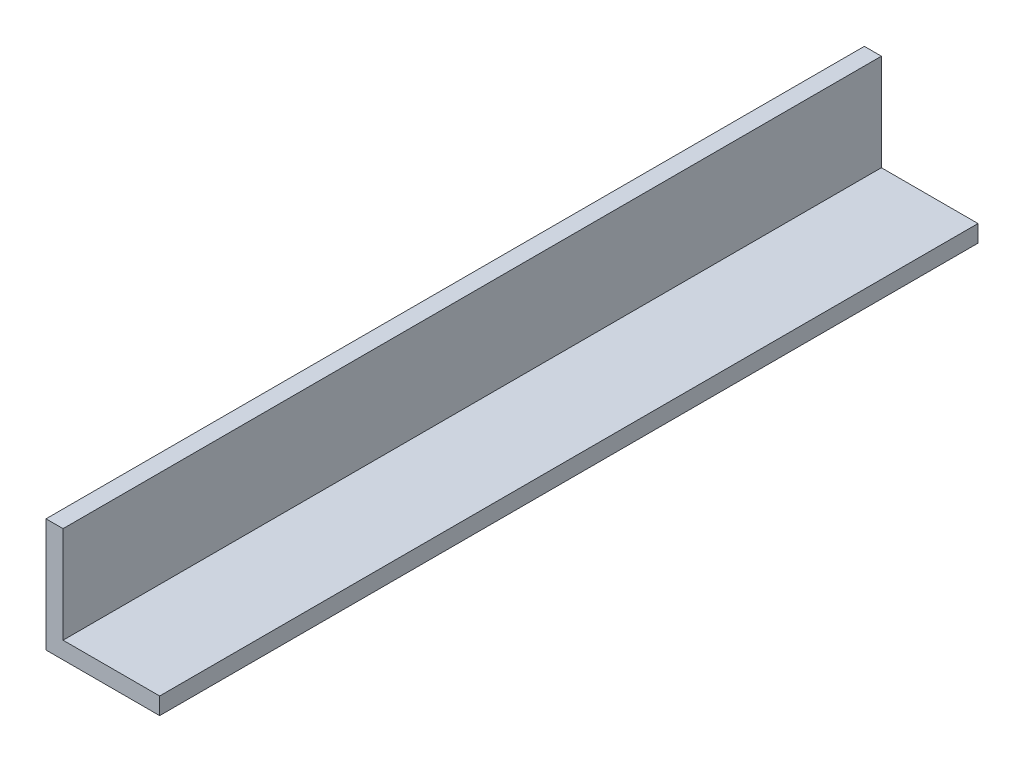
ISO-10303-21;
HEADER;
FILE_DESCRIPTION(('STEP AP214'),'2;1');
FILE_NAME('part.step','',(''),(''),'','','');
FILE_SCHEMA(('AUTOMOTIVE_DESIGN { 1 0 10303 214 1 1 1 1 }'));
ENDSEC;
DATA;
#1=APPLICATION_CONTEXT('core data for automotive mechanical design processes');
#2=APPLICATION_PROTOCOL_DEFINITION('international standard','automotive_design',2000,#1);
#3=PRODUCT_CONTEXT('',#1,'mechanical');
#4=PRODUCT('Part','Part','',(#3));
#5=PRODUCT_RELATED_PRODUCT_CATEGORY('part','',(#4));
#6=PRODUCT_DEFINITION_FORMATION('','',#4);
#7=PRODUCT_DEFINITION_CONTEXT('part definition',#1,'design');
#8=PRODUCT_DEFINITION('design','',#6,#7);
#9=PRODUCT_DEFINITION_SHAPE('','',#8);
#10=(LENGTH_UNIT() NAMED_UNIT(*) SI_UNIT(.MILLI.,.METRE.));
#11=(NAMED_UNIT(*) PLANE_ANGLE_UNIT() SI_UNIT($,.RADIAN.));
#12=(NAMED_UNIT(*) SI_UNIT($,.STERADIAN.) SOLID_ANGLE_UNIT());
#13=UNCERTAINTY_MEASURE_WITH_UNIT(LENGTH_MEASURE(1.E-05),#10,'distance_accuracy_value','');
#14=(GEOMETRIC_REPRESENTATION_CONTEXT(3) GLOBAL_UNCERTAINTY_ASSIGNED_CONTEXT((#13)) GLOBAL_UNIT_ASSIGNED_CONTEXT((#10,
#11,#12)) REPRESENTATION_CONTEXT('',''));
#15=CARTESIAN_POINT('',(0.,0.,0.));
#16=DIRECTION('',(0.,0.,1.));
#17=DIRECTION('',(1.,0.,0.));
#18=AXIS2_PLACEMENT_3D('',#15,#16,#17);
#19=CARTESIAN_POINT('',(20.,0.,144.));
#20=DIRECTION('',(-1.,0.,0.));
#21=DIRECTION('',(0.,0.,1.));
#22=AXIS2_PLACEMENT_3D('',#19,#20,#21);
#23=PLANE('',#22);
#24=DIRECTION('',(0.,1.,0.));
#25=VECTOR('',#24,1.);
#26=CARTESIAN_POINT('',(20.,0.,0.));
#27=LINE('',#26,#25);
#28=CARTESIAN_POINT('',(20.,0.,0.));
#29=VERTEX_POINT('',#28);
#30=CARTESIAN_POINT('',(20.,3.,0.));
#31=VERTEX_POINT('',#30);
#32=EDGE_CURVE('E128',#29,#31,#27,.T.);
#33=ORIENTED_EDGE('',*,*,#32,.T.);
#34=DIRECTION('',(0.,0.,-1.));
#35=VECTOR('',#34,1.);
#36=CARTESIAN_POINT('',(20.,3.,144.));
#37=LINE('',#36,#35);
#38=CARTESIAN_POINT('',(20.,3.,144.));
#39=VERTEX_POINT('',#38);
#40=EDGE_CURVE('E11',#39,#31,#37,.T.);
#41=ORIENTED_EDGE('',*,*,#40,.F.);
#42=DIRECTION('',(0.,1.,0.));
#43=VECTOR('',#42,1.);
#44=CARTESIAN_POINT('',(20.,0.,144.));
#45=LINE('',#44,#43);
#46=CARTESIAN_POINT('',(20.,0.,144.));
#47=VERTEX_POINT('',#46);
#48=EDGE_CURVE('E144',#47,#39,#45,.T.);
#49=ORIENTED_EDGE('',*,*,#48,.F.);
#50=DIRECTION('',(0.,0.,-1.));
#51=VECTOR('',#50,1.);
#52=CARTESIAN_POINT('',(20.,0.,144.));
#53=LINE('',#52,#51);
#54=EDGE_CURVE('E124',#47,#29,#53,.T.);
#55=ORIENTED_EDGE('',*,*,#54,.T.);
#56=EDGE_LOOP('',(#33,#41,#49,#55));
#57=FACE_BOUND('',#56,.T.);
#58=ADVANCED_FACE('F39',(#57),#23,.F.);
#59=CARTESIAN_POINT('',(20.,3.,144.));
#60=DIRECTION('',(0.,-1.,0.));
#61=DIRECTION('',(0.,0.,-1.));
#62=AXIS2_PLACEMENT_3D('',#59,#60,#61);
#63=PLANE('',#62);
#64=DIRECTION('',(-1.,0.,0.));
#65=VECTOR('',#64,1.);
#66=CARTESIAN_POINT('',(20.,3.,0.));
#67=LINE('',#66,#65);
#68=CARTESIAN_POINT('',(3.,3.,0.));
#69=VERTEX_POINT('',#68);
#70=EDGE_CURVE('E132',#31,#69,#67,.T.);
#71=ORIENTED_EDGE('',*,*,#70,.T.);
#72=DIRECTION('',(0.,0.,-1.));
#73=VECTOR('',#72,1.);
#74=CARTESIAN_POINT('',(3.,3.,144.));
#75=LINE('',#74,#73);
#76=CARTESIAN_POINT('',(3.,3.,144.));
#77=VERTEX_POINT('',#76);
#78=EDGE_CURVE('E48',#77,#69,#75,.T.);
#79=ORIENTED_EDGE('',*,*,#78,.F.);
#80=DIRECTION('',(-1.,0.,0.));
#81=VECTOR('',#80,1.);
#82=CARTESIAN_POINT('',(20.,3.,144.));
#83=LINE('',#82,#81);
#84=EDGE_CURVE('E93',#39,#77,#83,.T.);
#85=ORIENTED_EDGE('',*,*,#84,.F.);
#86=ORIENTED_EDGE('',*,*,#40,.T.);
#87=EDGE_LOOP('',(#71,#79,#85,#86));
#88=FACE_BOUND('',#87,.T.);
#89=ADVANCED_FACE('F172',(#88),#63,.F.);
#90=CARTESIAN_POINT('',(3.,20.,144.));
#91=DIRECTION('',(-1.,0.,0.));
#92=DIRECTION('',(0.,-1.,0.));
#93=AXIS2_PLACEMENT_3D('',#90,#91,#92);
#94=PLANE('',#93);
#95=DIRECTION('',(0.,1.,0.));
#96=VECTOR('',#95,1.);
#97=CARTESIAN_POINT('',(3.,20.,0.));
#98=LINE('',#97,#96);
#99=CARTESIAN_POINT('',(3.,20.,0.));
#100=VERTEX_POINT('',#99);
#101=EDGE_CURVE('E135',#69,#100,#98,.T.);
#102=ORIENTED_EDGE('',*,*,#101,.T.);
#103=DIRECTION('',(0.,0.,-1.));
#104=VECTOR('',#103,1.);
#105=CARTESIAN_POINT('',(3.,20.,144.));
#106=LINE('',#105,#104);
#107=CARTESIAN_POINT('',(3.,20.,144.));
#108=VERTEX_POINT('',#107);
#109=EDGE_CURVE('E117',#108,#100,#106,.T.);
#110=ORIENTED_EDGE('',*,*,#109,.F.);
#111=DIRECTION('',(0.,1.,0.));
#112=VECTOR('',#111,1.);
#113=CARTESIAN_POINT('',(3.,20.,144.));
#114=LINE('',#113,#112);
#115=EDGE_CURVE('E106',#77,#108,#114,.T.);
#116=ORIENTED_EDGE('',*,*,#115,.F.);
#117=ORIENTED_EDGE('',*,*,#78,.T.);
#118=EDGE_LOOP('',(#102,#110,#116,#117));
#119=FACE_BOUND('',#118,.T.);
#120=ADVANCED_FACE('F154',(#119),#94,.F.);
#121=CARTESIAN_POINT('',(0.,20.,144.));
#122=DIRECTION('',(0.,-1.,0.));
#123=DIRECTION('',(0.,0.,-1.));
#124=AXIS2_PLACEMENT_3D('',#121,#122,#123);
#125=PLANE('',#124);
#126=DIRECTION('',(-1.,0.,0.));
#127=VECTOR('',#126,1.);
#128=CARTESIAN_POINT('',(0.,20.,0.));
#129=LINE('',#128,#127);
#130=CARTESIAN_POINT('',(0.,20.,0.));
#131=VERTEX_POINT('',#130);
#132=EDGE_CURVE('E115',#100,#131,#129,.T.);
#133=ORIENTED_EDGE('',*,*,#132,.T.);
#134=DIRECTION('',(0.,0.,-1.));
#135=VECTOR('',#134,1.);
#136=CARTESIAN_POINT('',(0.,20.,144.));
#137=LINE('',#136,#135);
#138=CARTESIAN_POINT('',(0.,20.,144.));
#139=VERTEX_POINT('',#138);
#140=EDGE_CURVE('E112',#139,#131,#137,.T.);
#141=ORIENTED_EDGE('',*,*,#140,.F.);
#142=DIRECTION('',(-1.,0.,0.));
#143=VECTOR('',#142,1.);
#144=CARTESIAN_POINT('',(0.,20.,144.));
#145=LINE('',#144,#143);
#146=EDGE_CURVE('E100',#108,#139,#145,.T.);
#147=ORIENTED_EDGE('',*,*,#146,.F.);
#148=ORIENTED_EDGE('',*,*,#109,.T.);
#149=EDGE_LOOP('',(#133,#141,#147,#148));
#150=FACE_BOUND('',#149,.T.);
#151=ADVANCED_FACE('F113',(#150),#125,.F.);
#152=CARTESIAN_POINT('',(0.,0.,144.));
#153=DIRECTION('',(1.,0.,0.));
#154=DIRECTION('',(0.,0.,-1.));
#155=AXIS2_PLACEMENT_3D('',#152,#153,#154);
#156=PLANE('',#155);
#157=DIRECTION('',(0.,-1.,0.));
#158=VECTOR('',#157,1.);
#159=CARTESIAN_POINT('',(0.,0.,0.));
#160=LINE('',#159,#158);
#161=CARTESIAN_POINT('',(0.,0.,0.));
#162=VERTEX_POINT('',#161);
#163=EDGE_CURVE('E79',#131,#162,#160,.T.);
#164=ORIENTED_EDGE('',*,*,#163,.T.);
#165=DIRECTION('',(0.,0.,-1.));
#166=VECTOR('',#165,1.);
#167=CARTESIAN_POINT('',(0.,0.,144.));
#168=LINE('',#167,#166);
#169=CARTESIAN_POINT('',(0.,0.,144.));
#170=VERTEX_POINT('',#169);
#171=EDGE_CURVE('E118',#170,#162,#168,.T.);
#172=ORIENTED_EDGE('',*,*,#171,.F.);
#173=DIRECTION('',(0.,-1.,0.));
#174=VECTOR('',#173,1.);
#175=CARTESIAN_POINT('',(0.,0.,144.));
#176=LINE('',#175,#174);
#177=EDGE_CURVE('E104',#139,#170,#176,.T.);
#178=ORIENTED_EDGE('',*,*,#177,.F.);
#179=ORIENTED_EDGE('',*,*,#140,.T.);
#180=EDGE_LOOP('',(#164,#172,#178,#179));
#181=FACE_BOUND('',#180,.T.);
#182=ADVANCED_FACE('F120',(#181),#156,.F.);
#183=CARTESIAN_POINT('',(0.,0.,144.));
#184=DIRECTION('',(0.,1.,0.));
#185=DIRECTION('',(0.,0.,1.));
#186=AXIS2_PLACEMENT_3D('',#183,#184,#185);
#187=PLANE('',#186);
#188=DIRECTION('',(1.,0.,0.));
#189=VECTOR('',#188,1.);
#190=CARTESIAN_POINT('',(0.,0.,0.));
#191=LINE('',#190,#189);
#192=EDGE_CURVE('E85',#162,#29,#191,.T.);
#193=ORIENTED_EDGE('',*,*,#192,.T.);
#194=ORIENTED_EDGE('',*,*,#54,.F.);
#195=DIRECTION('',(1.,0.,0.));
#196=VECTOR('',#195,1.);
#197=CARTESIAN_POINT('',(0.,0.,144.));
#198=LINE('',#197,#196);
#199=EDGE_CURVE('E56',#170,#47,#198,.T.);
#200=ORIENTED_EDGE('',*,*,#199,.F.);
#201=ORIENTED_EDGE('',*,*,#171,.T.);
#202=EDGE_LOOP('',(#193,#194,#200,#201));
#203=FACE_BOUND('',#202,.T.);
#204=ADVANCED_FACE('F161',(#203),#187,.F.);
#205=CARTESIAN_POINT('',(0.,0.,144.));
#206=DIRECTION('',(0.,0.,1.));
#207=DIRECTION('',(1.,0.,0.));
#208=AXIS2_PLACEMENT_3D('',#205,#206,#207);
#209=PLANE('',#208);
#210=ORIENTED_EDGE('',*,*,#48,.T.);
#211=ORIENTED_EDGE('',*,*,#84,.T.);
#212=ORIENTED_EDGE('',*,*,#115,.T.);
#213=ORIENTED_EDGE('',*,*,#146,.T.);
#214=ORIENTED_EDGE('',*,*,#177,.T.);
#215=ORIENTED_EDGE('',*,*,#199,.T.);
#216=EDGE_LOOP('',(#210,#211,#212,#213,#214,#215));
#217=FACE_BOUND('',#216,.T.);
#218=ADVANCED_FACE('F102',(#217),#209,.T.);
#219=CARTESIAN_POINT('',(0.,0.,0.));
#220=DIRECTION('',(0.,0.,1.));
#221=DIRECTION('',(1.,0.,0.));
#222=AXIS2_PLACEMENT_3D('',#219,#220,#221);
#223=PLANE('',#222);
#224=ORIENTED_EDGE('',*,*,#32,.F.);
#225=ORIENTED_EDGE('',*,*,#192,.F.);
#226=ORIENTED_EDGE('',*,*,#163,.F.);
#227=ORIENTED_EDGE('',*,*,#132,.F.);
#228=ORIENTED_EDGE('',*,*,#101,.F.);
#229=ORIENTED_EDGE('',*,*,#70,.F.);
#230=EDGE_LOOP('',(#224,#225,#226,#227,#228,#229));
#231=FACE_BOUND('',#230,.T.);
#232=ADVANCED_FACE('F157',(#231),#223,.F.);
#233=CLOSED_SHELL('',(#58,#89,#120,#151,#182,#204,#218,#232));
#234=MANIFOLD_SOLID_BREP('B2',#233);
#235=ADVANCED_BREP_SHAPE_REPRESENTATION('',(#18,#234),#14);
#236=SHAPE_DEFINITION_REPRESENTATION(#9,#235);
ENDSEC;
END-ISO-10303-21;
